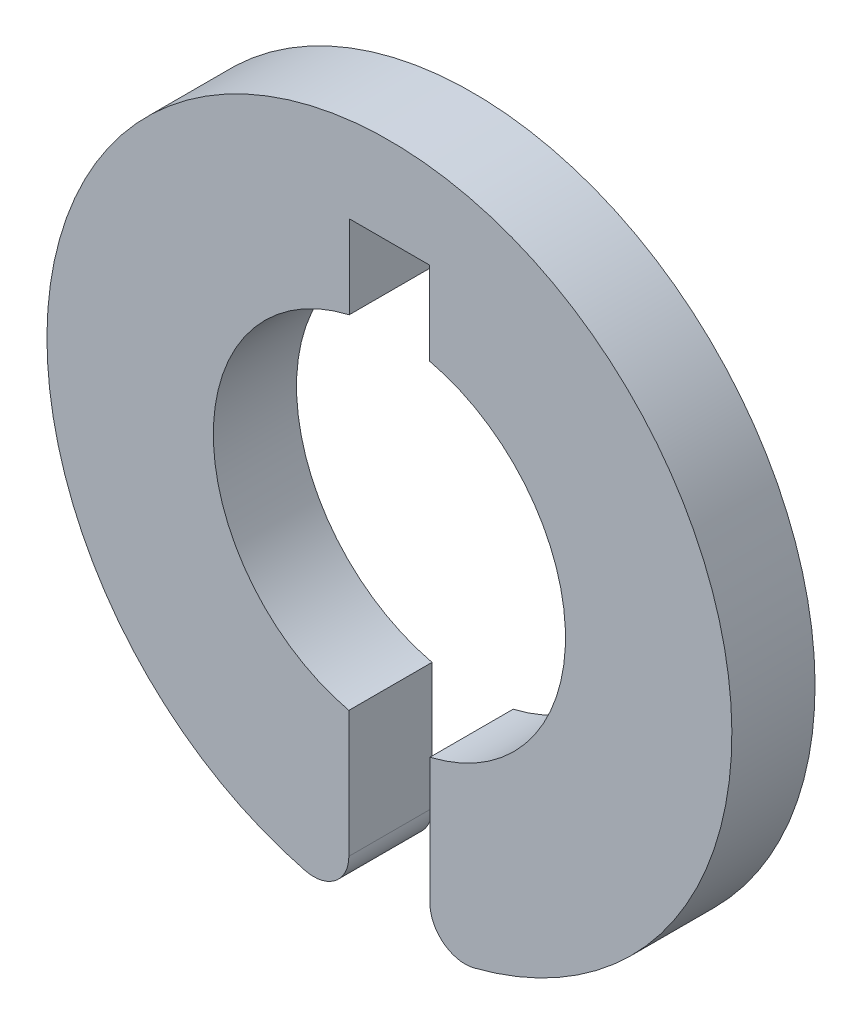
ISO-10303-21;
HEADER;
FILE_DESCRIPTION(('STEP AP214'),'2;1');
FILE_NAME('part.step','',(''),(''),'','','');
FILE_SCHEMA(('AUTOMOTIVE_DESIGN { 1 0 10303 214 1 1 1 1 }'));
ENDSEC;
DATA;
#1=APPLICATION_CONTEXT('core data for automotive mechanical design processes');
#2=APPLICATION_PROTOCOL_DEFINITION('international standard','automotive_design',2000,#1);
#3=PRODUCT_CONTEXT('',#1,'mechanical');
#4=PRODUCT('Part','Part','',(#3));
#5=PRODUCT_RELATED_PRODUCT_CATEGORY('part','',(#4));
#6=PRODUCT_DEFINITION_FORMATION('','',#4);
#7=PRODUCT_DEFINITION_CONTEXT('part definition',#1,'design');
#8=PRODUCT_DEFINITION('design','',#6,#7);
#9=PRODUCT_DEFINITION_SHAPE('','',#8);
#10=(LENGTH_UNIT() NAMED_UNIT(*) SI_UNIT(.MILLI.,.METRE.));
#11=(NAMED_UNIT(*) PLANE_ANGLE_UNIT() SI_UNIT($,.RADIAN.));
#12=(NAMED_UNIT(*) SI_UNIT($,.STERADIAN.) SOLID_ANGLE_UNIT());
#13=UNCERTAINTY_MEASURE_WITH_UNIT(LENGTH_MEASURE(1.E-05),#10,'distance_accuracy_value','');
#14=(GEOMETRIC_REPRESENTATION_CONTEXT(3) GLOBAL_UNCERTAINTY_ASSIGNED_CONTEXT((#13)) GLOBAL_UNIT_ASSIGNED_CONTEXT((#10,
#11,#12)) REPRESENTATION_CONTEXT('',''));
#15=CARTESIAN_POINT('',(0.,0.,0.));
#16=DIRECTION('',(0.,0.,1.));
#17=DIRECTION('',(1.,0.,0.));
#18=AXIS2_PLACEMENT_3D('',#15,#16,#17);
#19=CARTESIAN_POINT('',(0.,0.,3.));
#20=DIRECTION('',(0.,0.,-1.));
#21=DIRECTION('',(-1.,0.,0.));
#22=AXIS2_PLACEMENT_3D('',#19,#20,#21);
#23=CYLINDRICAL_SURFACE('',#22,6.35);
#24=CARTESIAN_POINT('',(0.,0.,0.));
#25=DIRECTION('',(0.,0.,-1.));
#26=DIRECTION('',(1.,0.,0.));
#27=AXIS2_PLACEMENT_3D('',#24,#25,#26);
#28=CIRCLE('',#27,6.35);
#29=CARTESIAN_POINT('',(1.4475,6.18281843094232,0.));
#30=VERTEX_POINT('',#29);
#31=CARTESIAN_POINT('',(1.4625,-6.17928747915162,0.));
#32=VERTEX_POINT('',#31);
#33=EDGE_CURVE('E139',#30,#32,#28,.T.);
#34=ORIENTED_EDGE('',*,*,#33,.T.);
#35=DIRECTION('',(0.,0.,-1.));
#36=VECTOR('',#35,1.);
#37=CARTESIAN_POINT('',(1.4625,-6.17928747915162,3.));
#38=LINE('',#37,#36);
#39=CARTESIAN_POINT('',(1.4625,-6.17928747915162,3.));
#40=VERTEX_POINT('',#39);
#41=EDGE_CURVE('E125',#40,#32,#38,.T.);
#42=ORIENTED_EDGE('',*,*,#41,.F.);
#43=CARTESIAN_POINT('',(0.,0.,3.));
#44=DIRECTION('',(0.,0.,-1.));
#45=DIRECTION('',(1.,0.,0.));
#46=AXIS2_PLACEMENT_3D('',#43,#44,#45);
#47=CIRCLE('',#46,6.35);
#48=CARTESIAN_POINT('',(1.4475,6.18281843094232,3.));
#49=VERTEX_POINT('',#48);
#50=EDGE_CURVE('E130',#49,#40,#47,.T.);
#51=ORIENTED_EDGE('',*,*,#50,.F.);
#52=DIRECTION('',(0.,0.,-1.));
#53=VECTOR('',#52,1.);
#54=CARTESIAN_POINT('',(1.4475,6.18281843094232,3.));
#55=LINE('',#54,#53);
#56=EDGE_CURVE('E183',#49,#30,#55,.T.);
#57=ORIENTED_EDGE('',*,*,#56,.T.);
#58=EDGE_LOOP('',(#34,#42,#51,#57));
#59=FACE_BOUND('',#58,.T.);
#60=ADVANCED_FACE('F45',(#59),#23,.F.);
#61=CARTESIAN_POINT('',(1.4625,-12.2630988640718,3.));
#62=DIRECTION('',(1.,0.,0.));
#63=DIRECTION('',(0.,0.,-1.));
#64=AXIS2_PLACEMENT_3D('',#61,#62,#63);
#65=PLANE('',#64);
#66=DIRECTION('',(0.,-1.,0.));
#67=VECTOR('',#66,1.);
#68=CARTESIAN_POINT('',(1.4625,-12.2630988640718,0.));
#69=LINE('',#68,#67);
#70=CARTESIAN_POINT('',(1.4625,-10.7377764807245,0.));
#71=VERTEX_POINT('',#70);
#72=EDGE_CURVE('E187',#32,#71,#69,.T.);
#73=ORIENTED_EDGE('',*,*,#72,.T.);
#74=DIRECTION('',(0.,0.,-1.));
#75=VECTOR('',#74,1.);
#76=CARTESIAN_POINT('',(1.4625,-10.7377764807245,3.));
#77=LINE('',#76,#75);
#78=CARTESIAN_POINT('',(1.4625,-10.7377764807245,3.));
#79=VERTEX_POINT('',#78);
#80=EDGE_CURVE('E12',#71,#79,#77,.F.);
#81=ORIENTED_EDGE('',*,*,#80,.T.);
#82=DIRECTION('',(0.,-1.,0.));
#83=VECTOR('',#82,1.);
#84=CARTESIAN_POINT('',(1.4625,-12.2630988640718,3.));
#85=LINE('',#84,#83);
#86=EDGE_CURVE('E119',#40,#79,#85,.T.);
#87=ORIENTED_EDGE('',*,*,#86,.F.);
#88=ORIENTED_EDGE('',*,*,#41,.T.);
#89=EDGE_LOOP('',(#73,#81,#87,#88));
#90=FACE_BOUND('',#89,.T.);
#91=ADVANCED_FACE('F120',(#90),#65,.F.);
#92=CARTESIAN_POINT('',(0.,0.,3.));
#93=DIRECTION('',(0.,0.,-1.));
#94=DIRECTION('',(-1.,0.,0.));
#95=AXIS2_PLACEMENT_3D('',#92,#93,#94);
#96=CYLINDRICAL_SURFACE('',#95,12.35);
#97=CARTESIAN_POINT('',(0.,0.,0.));
#98=DIRECTION('',(0.,0.,1.));
#99=DIRECTION('',(-1.,0.,0.));
#100=AXIS2_PLACEMENT_3D('',#97,#98,#99);
#101=CIRCLE('',#100,12.35);
#102=CARTESIAN_POINT('',(3.04570171480144,-11.9685504997245,0.));
#103=VERTEX_POINT('',#102);
#104=CARTESIAN_POINT('',(-3.04570171480144,-11.9685504997245,0.));
#105=VERTEX_POINT('',#104);
#106=EDGE_CURVE('E188',#103,#105,#101,.T.);
#107=ORIENTED_EDGE('',*,*,#106,.T.);
#108=DIRECTION('',(0.,0.,-1.));
#109=VECTOR('',#108,1.);
#110=CARTESIAN_POINT('',(-3.04570171480144,-11.9685504997245,3.));
#111=LINE('',#110,#109);
#112=CARTESIAN_POINT('',(-3.04570171480144,-11.9685504997245,3.));
#113=VERTEX_POINT('',#112);
#114=EDGE_CURVE('E64',#105,#113,#111,.F.);
#115=ORIENTED_EDGE('',*,*,#114,.T.);
#116=CARTESIAN_POINT('',(0.,0.,3.));
#117=DIRECTION('',(0.,0.,1.));
#118=DIRECTION('',(-1.,0.,0.));
#119=AXIS2_PLACEMENT_3D('',#116,#117,#118);
#120=CIRCLE('',#119,12.35);
#121=CARTESIAN_POINT('',(3.04570171480144,-11.9685504997245,3.));
#122=VERTEX_POINT('',#121);
#123=EDGE_CURVE('E127',#122,#113,#120,.T.);
#124=ORIENTED_EDGE('',*,*,#123,.F.);
#125=DIRECTION('',(0.,0.,-1.));
#126=VECTOR('',#125,1.);
#127=CARTESIAN_POINT('',(3.04570171480144,-11.9685504997245,3.));
#128=LINE('',#127,#126);
#129=EDGE_CURVE('E152',#122,#103,#128,.T.);
#130=ORIENTED_EDGE('',*,*,#129,.T.);
#131=EDGE_LOOP('',(#107,#115,#124,#130));
#132=FACE_BOUND('',#131,.T.);
#133=ADVANCED_FACE('F233',(#132),#96,.T.);
#134=CARTESIAN_POINT('',(-1.4625,-12.2630988640718,3.));
#135=DIRECTION('',(-1.,0.,0.));
#136=DIRECTION('',(0.,0.,1.));
#137=AXIS2_PLACEMENT_3D('',#134,#135,#136);
#138=PLANE('',#137);
#139=DIRECTION('',(0.,1.,0.));
#140=VECTOR('',#139,1.);
#141=CARTESIAN_POINT('',(-1.4625,-12.2630988640718,3.));
#142=LINE('',#141,#140);
#143=CARTESIAN_POINT('',(-1.4625,-10.7377764807245,3.));
#144=VERTEX_POINT('',#143);
#145=CARTESIAN_POINT('',(-1.4625,-6.17928747915162,3.));
#146=VERTEX_POINT('',#145);
#147=EDGE_CURVE('E169',#144,#146,#142,.T.);
#148=ORIENTED_EDGE('',*,*,#147,.F.);
#149=DIRECTION('',(0.,0.,-1.));
#150=VECTOR('',#149,1.);
#151=CARTESIAN_POINT('',(-1.4625,-10.7377764807245,3.));
#152=LINE('',#151,#150);
#153=CARTESIAN_POINT('',(-1.4625,-10.7377764807245,0.));
#154=VERTEX_POINT('',#153);
#155=EDGE_CURVE('E137',#144,#154,#152,.T.);
#156=ORIENTED_EDGE('',*,*,#155,.T.);
#157=DIRECTION('',(0.,1.,0.));
#158=VECTOR('',#157,1.);
#159=CARTESIAN_POINT('',(-1.4625,-12.2630988640718,0.));
#160=LINE('',#159,#158);
#161=CARTESIAN_POINT('',(-1.4625,-6.17928747915162,0.));
#162=VERTEX_POINT('',#161);
#163=EDGE_CURVE('E193',#154,#162,#160,.T.);
#164=ORIENTED_EDGE('',*,*,#163,.T.);
#165=DIRECTION('',(0.,0.,-1.));
#166=VECTOR('',#165,1.);
#167=CARTESIAN_POINT('',(-1.4625,-6.17928747915162,3.));
#168=LINE('',#167,#166);
#169=EDGE_CURVE('E143',#146,#162,#168,.T.);
#170=ORIENTED_EDGE('',*,*,#169,.F.);
#171=EDGE_LOOP('',(#148,#156,#164,#170));
#172=FACE_BOUND('',#171,.T.);
#173=ADVANCED_FACE('F240',(#172),#138,.F.);
#174=CARTESIAN_POINT('',(0.,0.,3.));
#175=DIRECTION('',(0.,0.,-1.));
#176=DIRECTION('',(-1.,0.,0.));
#177=AXIS2_PLACEMENT_3D('',#174,#175,#176);
#178=CYLINDRICAL_SURFACE('',#177,6.35);
#179=CARTESIAN_POINT('',(0.,0.,0.));
#180=DIRECTION('',(0.,0.,-1.));
#181=DIRECTION('',(1.,0.,0.));
#182=AXIS2_PLACEMENT_3D('',#179,#180,#181);
#183=CIRCLE('',#182,6.35);
#184=CARTESIAN_POINT('',(-1.4475,6.18281843094232,0.));
#185=VERTEX_POINT('',#184);
#186=EDGE_CURVE('E191',#162,#185,#183,.T.);
#187=ORIENTED_EDGE('',*,*,#186,.T.);
#188=DIRECTION('',(0.,0.,-1.));
#189=VECTOR('',#188,1.);
#190=CARTESIAN_POINT('',(-1.4475,6.18281843094232,3.));
#191=LINE('',#190,#189);
#192=CARTESIAN_POINT('',(-1.4475,6.18281843094232,3.));
#193=VERTEX_POINT('',#192);
#194=EDGE_CURVE('E150',#193,#185,#191,.T.);
#195=ORIENTED_EDGE('',*,*,#194,.F.);
#196=CARTESIAN_POINT('',(0.,0.,3.));
#197=DIRECTION('',(0.,0.,-1.));
#198=DIRECTION('',(1.,0.,0.));
#199=AXIS2_PLACEMENT_3D('',#196,#197,#198);
#200=CIRCLE('',#199,6.35);
#201=EDGE_CURVE('E168',#146,#193,#200,.T.);
#202=ORIENTED_EDGE('',*,*,#201,.F.);
#203=ORIENTED_EDGE('',*,*,#169,.T.);
#204=EDGE_LOOP('',(#187,#195,#202,#203));
#205=FACE_BOUND('',#204,.T.);
#206=ADVANCED_FACE('F239',(#205),#178,.F.);
#207=CARTESIAN_POINT('',(-1.4475,9.18281843094232,3.));
#208=DIRECTION('',(-1.,0.,0.));
#209=DIRECTION('',(0.,-1.,0.));
#210=AXIS2_PLACEMENT_3D('',#207,#208,#209);
#211=PLANE('',#210);
#212=DIRECTION('',(0.,1.,0.));
#213=VECTOR('',#212,1.);
#214=CARTESIAN_POINT('',(-1.4475,9.18281843094232,0.));
#215=LINE('',#214,#213);
#216=CARTESIAN_POINT('',(-1.4475,9.18281843094232,0.));
#217=VERTEX_POINT('',#216);
#218=EDGE_CURVE('E192',#185,#217,#215,.T.);
#219=ORIENTED_EDGE('',*,*,#218,.T.);
#220=DIRECTION('',(0.,0.,-1.));
#221=VECTOR('',#220,1.);
#222=CARTESIAN_POINT('',(-1.4475,9.18281843094232,3.));
#223=LINE('',#222,#221);
#224=CARTESIAN_POINT('',(-1.4475,9.18281843094232,3.));
#225=VERTEX_POINT('',#224);
#226=EDGE_CURVE('E204',#225,#217,#223,.T.);
#227=ORIENTED_EDGE('',*,*,#226,.F.);
#228=DIRECTION('',(0.,1.,0.));
#229=VECTOR('',#228,1.);
#230=CARTESIAN_POINT('',(-1.4475,9.18281843094232,3.));
#231=LINE('',#230,#229);
#232=EDGE_CURVE('E173',#193,#225,#231,.T.);
#233=ORIENTED_EDGE('',*,*,#232,.F.);
#234=ORIENTED_EDGE('',*,*,#194,.T.);
#235=EDGE_LOOP('',(#219,#227,#233,#234));
#236=FACE_BOUND('',#235,.T.);
#237=ADVANCED_FACE('F211',(#236),#211,.F.);
#238=CARTESIAN_POINT('',(-1.4475,9.18281843094232,3.));
#239=DIRECTION('',(0.,1.,0.));
#240=DIRECTION('',(-1.,0.,0.));
#241=AXIS2_PLACEMENT_3D('',#238,#239,#240);
#242=PLANE('',#241);
#243=DIRECTION('',(1.,0.,0.));
#244=VECTOR('',#243,1.);
#245=CARTESIAN_POINT('',(-1.4475,9.18281843094232,0.));
#246=LINE('',#245,#244);
#247=CARTESIAN_POINT('',(1.4475,9.18281843094231,0.));
#248=VERTEX_POINT('',#247);
#249=EDGE_CURVE('E197',#217,#248,#246,.T.);
#250=ORIENTED_EDGE('',*,*,#249,.T.);
#251=DIRECTION('',(0.,0.,-1.));
#252=VECTOR('',#251,1.);
#253=CARTESIAN_POINT('',(1.4475,9.18281843094231,3.));
#254=LINE('',#253,#252);
#255=CARTESIAN_POINT('',(1.4475,9.18281843094231,3.));
#256=VERTEX_POINT('',#255);
#257=EDGE_CURVE('E203',#256,#248,#254,.T.);
#258=ORIENTED_EDGE('',*,*,#257,.F.);
#259=DIRECTION('',(1.,0.,0.));
#260=VECTOR('',#259,1.);
#261=CARTESIAN_POINT('',(-1.4475,9.18281843094232,3.));
#262=LINE('',#261,#260);
#263=EDGE_CURVE('E180',#225,#256,#262,.T.);
#264=ORIENTED_EDGE('',*,*,#263,.F.);
#265=ORIENTED_EDGE('',*,*,#226,.T.);
#266=EDGE_LOOP('',(#250,#258,#264,#265));
#267=FACE_BOUND('',#266,.T.);
#268=ADVANCED_FACE('F224',(#267),#242,.F.);
#269=CARTESIAN_POINT('',(1.4475,9.18281843094231,3.));
#270=DIRECTION('',(1.,0.,0.));
#271=DIRECTION('',(0.,1.,0.));
#272=AXIS2_PLACEMENT_3D('',#269,#270,#271);
#273=PLANE('',#272);
#274=DIRECTION('',(0.,-1.,0.));
#275=VECTOR('',#274,1.);
#276=CARTESIAN_POINT('',(1.4475,9.18281843094231,0.));
#277=LINE('',#276,#275);
#278=EDGE_CURVE('E138',#248,#30,#277,.T.);
#279=ORIENTED_EDGE('',*,*,#278,.T.);
#280=ORIENTED_EDGE('',*,*,#56,.F.);
#281=DIRECTION('',(0.,-1.,0.));
#282=VECTOR('',#281,1.);
#283=CARTESIAN_POINT('',(1.4475,9.18281843094231,3.));
#284=LINE('',#283,#282);
#285=EDGE_CURVE('E132',#256,#49,#284,.T.);
#286=ORIENTED_EDGE('',*,*,#285,.F.);
#287=ORIENTED_EDGE('',*,*,#257,.T.);
#288=EDGE_LOOP('',(#279,#280,#286,#287));
#289=FACE_BOUND('',#288,.T.);
#290=ADVANCED_FACE('F226',(#289),#273,.F.);
#291=CARTESIAN_POINT('',(0.,0.,3.));
#292=DIRECTION('',(0.,0.,1.));
#293=DIRECTION('',(1.,0.,0.));
#294=AXIS2_PLACEMENT_3D('',#291,#292,#293);
#295=PLANE('',#294);
#296=ORIENTED_EDGE('',*,*,#123,.T.);
#297=CARTESIAN_POINT('',(-2.7325,-10.7377764807245,3.));
#298=DIRECTION('',(0.,0.,1.));
#299=DIRECTION('',(1.,0.,0.));
#300=AXIS2_PLACEMENT_3D('',#297,#298,#299);
#301=CIRCLE('',#300,1.27);
#302=EDGE_CURVE('E49',#113,#144,#301,.T.);
#303=ORIENTED_EDGE('',*,*,#302,.T.);
#304=ORIENTED_EDGE('',*,*,#147,.T.);
#305=ORIENTED_EDGE('',*,*,#201,.T.);
#306=ORIENTED_EDGE('',*,*,#232,.T.);
#307=ORIENTED_EDGE('',*,*,#263,.T.);
#308=ORIENTED_EDGE('',*,*,#285,.T.);
#309=ORIENTED_EDGE('',*,*,#50,.T.);
#310=ORIENTED_EDGE('',*,*,#86,.T.);
#311=CARTESIAN_POINT('',(2.7325,-10.7377764807245,3.));
#312=DIRECTION('',(0.,0.,1.));
#313=DIRECTION('',(1.,0.,0.));
#314=AXIS2_PLACEMENT_3D('',#311,#312,#313);
#315=CIRCLE('',#314,1.27);
#316=EDGE_CURVE('E160',#79,#122,#315,.T.);
#317=ORIENTED_EDGE('',*,*,#316,.T.);
#318=EDGE_LOOP('',(#296,#303,#304,#305,#306,#307,#308,#309,#310,#317));
#319=FACE_BOUND('',#318,.T.);
#320=ADVANCED_FACE('F128',(#319),#295,.T.);
#321=CARTESIAN_POINT('',(0.,0.,0.));
#322=DIRECTION('',(0.,0.,1.));
#323=DIRECTION('',(1.,0.,0.));
#324=AXIS2_PLACEMENT_3D('',#321,#322,#323);
#325=PLANE('',#324);
#326=ORIENTED_EDGE('',*,*,#163,.F.);
#327=CARTESIAN_POINT('',(-2.7325,-10.7377764807245,0.));
#328=DIRECTION('',(0.,0.,1.));
#329=DIRECTION('',(1.,0.,0.));
#330=AXIS2_PLACEMENT_3D('',#327,#328,#329);
#331=CIRCLE('',#330,1.27);
#332=EDGE_CURVE('E155',#154,#105,#331,.F.);
#333=ORIENTED_EDGE('',*,*,#332,.T.);
#334=ORIENTED_EDGE('',*,*,#106,.F.);
#335=CARTESIAN_POINT('',(2.7325,-10.7377764807245,0.));
#336=DIRECTION('',(0.,0.,1.));
#337=DIRECTION('',(1.,0.,0.));
#338=AXIS2_PLACEMENT_3D('',#335,#336,#337);
#339=CIRCLE('',#338,1.27);
#340=EDGE_CURVE('E145',#103,#71,#339,.F.);
#341=ORIENTED_EDGE('',*,*,#340,.T.);
#342=ORIENTED_EDGE('',*,*,#72,.F.);
#343=ORIENTED_EDGE('',*,*,#33,.F.);
#344=ORIENTED_EDGE('',*,*,#278,.F.);
#345=ORIENTED_EDGE('',*,*,#249,.F.);
#346=ORIENTED_EDGE('',*,*,#218,.F.);
#347=ORIENTED_EDGE('',*,*,#186,.F.);
#348=EDGE_LOOP('',(#326,#333,#334,#341,#342,#343,#344,#345,#346,#347));
#349=FACE_BOUND('',#348,.T.);
#350=ADVANCED_FACE('F218',(#349),#325,.F.);
#351=CARTESIAN_POINT('',(-2.7325,-10.7377764807245,3.));
#352=DIRECTION('',(0.,0.,-1.));
#353=DIRECTION('',(-1.,0.,0.));
#354=AXIS2_PLACEMENT_3D('',#351,#352,#353);
#355=CYLINDRICAL_SURFACE('',#354,1.27);
#356=ORIENTED_EDGE('',*,*,#302,.F.);
#357=ORIENTED_EDGE('',*,*,#114,.F.);
#358=ORIENTED_EDGE('',*,*,#332,.F.);
#359=ORIENTED_EDGE('',*,*,#155,.F.);
#360=EDGE_LOOP('',(#356,#357,#358,#359));
#361=FACE_BOUND('',#360,.T.);
#362=ADVANCED_FACE('F234',(#361),#355,.T.);
#363=CARTESIAN_POINT('',(2.7325,-10.7377764807245,3.));
#364=DIRECTION('',(0.,0.,-1.));
#365=DIRECTION('',(-1.,0.,0.));
#366=AXIS2_PLACEMENT_3D('',#363,#364,#365);
#367=CYLINDRICAL_SURFACE('',#366,1.27);
#368=ORIENTED_EDGE('',*,*,#316,.F.);
#369=ORIENTED_EDGE('',*,*,#80,.F.);
#370=ORIENTED_EDGE('',*,*,#340,.F.);
#371=ORIENTED_EDGE('',*,*,#129,.F.);
#372=EDGE_LOOP('',(#368,#369,#370,#371));
#373=FACE_BOUND('',#372,.T.);
#374=ADVANCED_FACE('F42',(#373),#367,.T.);
#375=CLOSED_SHELL('',(#60,#91,#133,#173,#206,#237,#268,#290,#320,#350,#362,#374));
#376=MANIFOLD_SOLID_BREP('B2',#375);
#377=ADVANCED_BREP_SHAPE_REPRESENTATION('',(#18,#376),#14);
#378=SHAPE_DEFINITION_REPRESENTATION(#9,#377);
ENDSEC;
END-ISO-10303-21;
